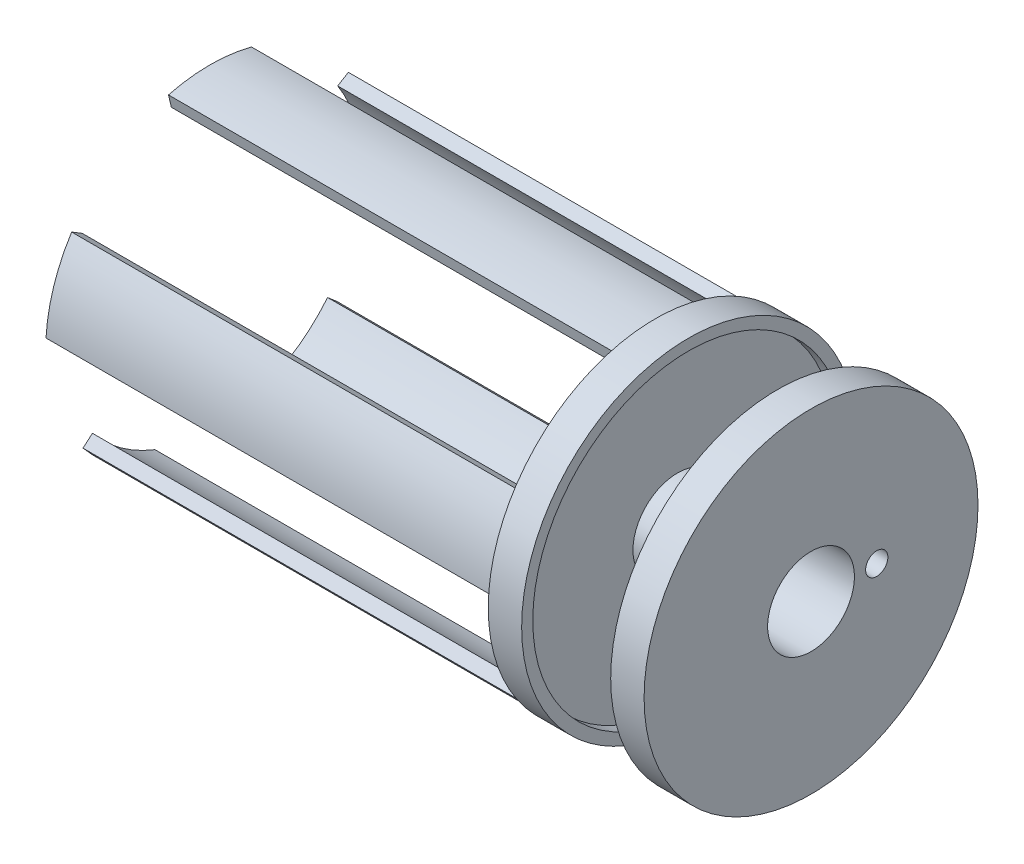
ISO-10303-21;
HEADER;
FILE_DESCRIPTION(('STEP AP214'),'2;1');
FILE_NAME('part.step','',(''),(''),'','','');
FILE_SCHEMA(('AUTOMOTIVE_DESIGN { 1 0 10303 214 1 1 1 1 }'));
ENDSEC;
DATA;
#1=APPLICATION_CONTEXT('core data for automotive mechanical design processes');
#2=APPLICATION_PROTOCOL_DEFINITION('international standard','automotive_design',2000,#1);
#3=PRODUCT_CONTEXT('',#1,'mechanical');
#4=PRODUCT('Part','Part','',(#3));
#5=PRODUCT_RELATED_PRODUCT_CATEGORY('part','',(#4));
#6=PRODUCT_DEFINITION_FORMATION('','',#4);
#7=PRODUCT_DEFINITION_CONTEXT('part definition',#1,'design');
#8=PRODUCT_DEFINITION('design','',#6,#7);
#9=PRODUCT_DEFINITION_SHAPE('','',#8);
#10=(LENGTH_UNIT() NAMED_UNIT(*) SI_UNIT(.MILLI.,.METRE.));
#11=(NAMED_UNIT(*) PLANE_ANGLE_UNIT() SI_UNIT($,.RADIAN.));
#12=(NAMED_UNIT(*) SI_UNIT($,.STERADIAN.) SOLID_ANGLE_UNIT());
#13=UNCERTAINTY_MEASURE_WITH_UNIT(LENGTH_MEASURE(1.E-05),#10,'distance_accuracy_value','');
#14=(GEOMETRIC_REPRESENTATION_CONTEXT(3) GLOBAL_UNCERTAINTY_ASSIGNED_CONTEXT((#13)) GLOBAL_UNIT_ASSIGNED_CONTEXT((#10,
#11,#12)) REPRESENTATION_CONTEXT('',''));
#15=CARTESIAN_POINT('',(0.,0.,0.));
#16=DIRECTION('',(0.,0.,1.));
#17=DIRECTION('',(1.,0.,0.));
#18=AXIS2_PLACEMENT_3D('',#15,#16,#17);
#19=CARTESIAN_POINT('',(-52.1153846153846,0.,0.));
#20=DIRECTION('',(1.,0.,0.));
#21=DIRECTION('',(0.,0.,-1.));
#22=AXIS2_PLACEMENT_3D('',#19,#20,#21);
#23=PLANE('',#22);
#24=CARTESIAN_POINT('',(-52.1153846153846,0.,0.));
#25=DIRECTION('',(1.,0.,0.));
#26=DIRECTION('',(0.,0.,-1.));
#27=AXIS2_PLACEMENT_3D('',#24,#25,#26);
#28=CIRCLE('',#27,19.5);
#29=CARTESIAN_POINT('',(-52.1153846153846,0.,-19.5));
#30=VERTEX_POINT('',#29);
#31=EDGE_CURVE('E199',#30,#30,#28,.T.);
#32=ORIENTED_EDGE('',*,*,#31,.T.);
#33=EDGE_LOOP('',(#32));
#34=FACE_BOUND('',#33,.T.);
#35=CARTESIAN_POINT('',(-52.1153846153846,0.,0.));
#36=DIRECTION('',(-1.,0.,0.));
#37=DIRECTION('',(0.,0.,1.));
#38=AXIS2_PLACEMENT_3D('',#35,#36,#37);
#39=CIRCLE('',#38,75.);
#40=CARTESIAN_POINT('',(-52.1153846153846,0.,75.));
#41=VERTEX_POINT('',#40);
#42=EDGE_CURVE('E11',#41,#41,#39,.T.);
#43=ORIENTED_EDGE('',*,*,#42,.T.);
#44=EDGE_LOOP('',(#43));
#45=FACE_BOUND('',#44,.T.);
#46=CARTESIAN_POINT('',(-52.1153846153846,0.,0.));
#47=DIRECTION('',(-1.,0.,0.));
#48=DIRECTION('',(0.,0.,1.));
#49=AXIS2_PLACEMENT_3D('',#46,#47,#48);
#50=CIRCLE('',#49,73.8);
#51=CARTESIAN_POINT('',(-52.1153846153846,71.4045453496025,18.6502252913083));
#52=VERTEX_POINT('',#51);
#53=CARTESIAN_POINT('',(-52.1153846153846,71.4045453496025,-18.6502252913083));
#54=VERTEX_POINT('',#53);
#55=EDGE_CURVE('E304',#52,#54,#50,.T.);
#56=ORIENTED_EDGE('',*,*,#55,.F.);
#57=DIRECTION('',(0.,-0.973417168333576,-0.229039333725548));
#58=VECTOR('',#57,1.);
#59=CARTESIAN_POINT('',(-52.1153846153846,71.4045453496025,18.6502252913083));
#60=LINE('',#59,#58);
#61=CARTESIAN_POINT('',(-52.1153846153846,65.9516538255794,17.3671919915382));
#62=VERTEX_POINT('',#61);
#63=EDGE_CURVE('E292',#52,#62,#60,.T.);
#64=ORIENTED_EDGE('',*,*,#63,.T.);
#65=CARTESIAN_POINT('',(-52.1153846153846,0.,0.));
#66=DIRECTION('',(-1.,0.,0.));
#67=DIRECTION('',(0.,0.,1.));
#68=AXIS2_PLACEMENT_3D('',#65,#66,#67);
#69=CIRCLE('',#68,68.2);
#70=CARTESIAN_POINT('',(-52.1153846153846,65.9516538255794,-17.3671919915382));
#71=VERTEX_POINT('',#70);
#72=EDGE_CURVE('E314',#62,#71,#69,.T.);
#73=ORIENTED_EDGE('',*,*,#72,.T.);
#74=DIRECTION('',(0.,-0.973417168333576,0.229039333725548));
#75=VECTOR('',#74,1.);
#76=CARTESIAN_POINT('',(-52.1153846153846,71.4045453496025,-18.6502252913083));
#77=LINE('',#76,#75);
#78=EDGE_CURVE('E317',#54,#71,#77,.T.);
#79=ORIENTED_EDGE('',*,*,#78,.F.);
#80=EDGE_LOOP('',(#56,#64,#73,#79));
#81=FACE_BOUND('',#80,.T.);
#82=CARTESIAN_POINT('',(-52.1153846153846,0.,0.));
#83=DIRECTION('',(-1.,0.,0.));
#84=DIRECTION('',(0.,0.951056516295155,0.309016994374945));
#85=AXIS2_PLACEMENT_3D('',#82,#83,#84);
#86=CIRCLE('',#85,73.8);
#87=CARTESIAN_POINT('',(-52.1153846153846,39.8026362823151,-62.1465215838967));
#88=VERTEX_POINT('',#87);
#89=CARTESIAN_POINT('',(-52.1153846153846,4.32779969497213,-73.672994711768));
#90=VERTEX_POINT('',#89);
#91=EDGE_CURVE('E274',#88,#90,#86,.T.);
#92=ORIENTED_EDGE('',*,*,#91,.F.);
#93=DIRECTION('',(0.,-0.518631798458994,0.854997694515716));
#94=VECTOR('',#93,1.);
#95=CARTESIAN_POINT('',(-52.1153846153846,39.8026362823151,-62.1465215838967));
#96=LINE('',#95,#94);
#97=CARTESIAN_POINT('',(-52.1153846153846,36.8973629525388,-57.3569926613018));
#98=VERTEX_POINT('',#97);
#99=EDGE_CURVE('E262',#88,#98,#96,.T.);
#100=ORIENTED_EDGE('',*,*,#99,.T.);
#101=CARTESIAN_POINT('',(-52.1153846153846,0.,0.));
#102=DIRECTION('',(-1.,0.,0.));
#103=DIRECTION('',(0.,0.951056516295155,0.309016994374945));
#104=AXIS2_PLACEMENT_3D('',#101,#102,#103);
#105=CIRCLE('',#104,68.2);
#106=CARTESIAN_POINT('',(-52.1153846153846,3.86300072593597,-68.0905076012172));
#107=VERTEX_POINT('',#106);
#108=EDGE_CURVE('E284',#98,#107,#105,.T.);
#109=ORIENTED_EDGE('',*,*,#108,.T.);
#110=DIRECTION('',(0.,-0.0829730968038282,0.996551787518733));
#111=VECTOR('',#110,1.);
#112=CARTESIAN_POINT('',(-52.1153846153846,4.32779969497213,-73.672994711768));
#113=LINE('',#112,#111);
#114=EDGE_CURVE('E287',#90,#107,#113,.T.);
#115=ORIENTED_EDGE('',*,*,#114,.F.);
#116=EDGE_LOOP('',(#92,#100,#109,#115));
#117=FACE_BOUND('',#116,.T.);
#118=CARTESIAN_POINT('',(-52.1153846153846,0.,0.));
#119=DIRECTION('',(-1.,0.,0.));
#120=DIRECTION('',(0.,0.587785252292469,-0.809016994374951));
#121=AXIS2_PLACEMENT_3D('',#118,#119,#120);
#122=CIRCLE('',#121,73.8);
#123=CARTESIAN_POINT('',(-52.1153846153846,-46.8051632852823,-57.0588879127351));
#124=VERTEX_POINT('',#123);
#125=CARTESIAN_POINT('',(-52.1153846153846,-68.7298180416083,-26.8821894935552));
#126=VERTEX_POINT('',#125);
#127=EDGE_CURVE('E244',#124,#126,#122,.T.);
#128=ORIENTED_EDGE('',*,*,#127,.F.);
#129=DIRECTION('',(0.,0.652885089239435,0.757456969239055));
#130=VECTOR('',#129,1.);
#131=CARTESIAN_POINT('',(-52.1153846153846,-46.8051632852823,-57.0588879127351));
#132=LINE('',#131,#130);
#133=CARTESIAN_POINT('',(-52.1153846153846,-43.1478294256694,-52.8157629487006));
#134=VERTEX_POINT('',#133);
#135=EDGE_CURVE('E234',#124,#134,#132,.T.);
#136=ORIENTED_EDGE('',*,*,#135,.T.);
#137=CARTESIAN_POINT('',(-52.1153846153846,0.,0.));
#138=DIRECTION('',(-1.,0.,0.));
#139=DIRECTION('',(0.,0.587785252292469,-0.809016994374951));
#140=AXIS2_PLACEMENT_3D('',#137,#138,#139);
#141=CIRCLE('',#140,68.2);
#142=CARTESIAN_POINT('',(-52.1153846153846,-63.5641880783854,-24.7150560172468));
#143=VERTEX_POINT('',#142);
#144=EDGE_CURVE('E254',#134,#143,#141,.T.);
#145=ORIENTED_EDGE('',*,*,#144,.T.);
#146=DIRECTION('',(0.,0.922136974356975,0.386863542510487));
#147=VECTOR('',#146,1.);
#148=CARTESIAN_POINT('',(-52.1153846153846,-68.7298180416083,-26.8821894935552));
#149=LINE('',#148,#147);
#150=EDGE_CURVE('E257',#126,#143,#149,.T.);
#151=ORIENTED_EDGE('',*,*,#150,.F.);
#152=EDGE_LOOP('',(#128,#136,#145,#151));
#153=FACE_BOUND('',#152,.T.);
#154=CARTESIAN_POINT('',(-52.1153846153846,0.,0.));
#155=DIRECTION('',(-1.,0.,0.));
#156=DIRECTION('',(0.,-0.58778525229248,-0.809016994374942));
#157=AXIS2_PLACEMENT_3D('',#154,#155,#156);
#158=CIRCLE('',#157,73.8);
#159=CARTESIAN_POINT('',(-52.1153846153846,-68.729818041608,26.8821894935562));
#160=VERTEX_POINT('',#159);
#161=CARTESIAN_POINT('',(-52.1153846153846,-46.8051632852814,57.0588879127358));
#162=VERTEX_POINT('',#161);
#163=EDGE_CURVE('E217',#160,#162,#158,.T.);
#164=ORIENTED_EDGE('',*,*,#163,.F.);
#165=DIRECTION('',(0.,0.922136974356969,-0.3868635425105));
#166=VECTOR('',#165,1.);
#167=CARTESIAN_POINT('',(-52.1153846153846,-68.729818041608,26.8821894935562));
#168=LINE('',#167,#166);
#169=CARTESIAN_POINT('',(-52.1153846153846,-63.5641880783851,24.7150560172477));
#170=VERTEX_POINT('',#169);
#171=EDGE_CURVE('E209',#160,#170,#168,.T.);
#172=ORIENTED_EDGE('',*,*,#171,.T.);
#173=CARTESIAN_POINT('',(-52.1153846153846,0.,0.));
#174=DIRECTION('',(-1.,0.,0.));
#175=DIRECTION('',(0.,-0.58778525229248,-0.809016994374942));
#176=AXIS2_PLACEMENT_3D('',#173,#174,#175);
#177=CIRCLE('',#176,68.2);
#178=CARTESIAN_POINT('',(-52.1153846153846,-43.1478294256687,52.8157629487012));
#179=VERTEX_POINT('',#178);
#180=EDGE_CURVE('E227',#170,#179,#177,.T.);
#181=ORIENTED_EDGE('',*,*,#180,.T.);
#182=DIRECTION('',(0.,0.652885089239424,-0.757456969239065));
#183=VECTOR('',#182,1.);
#184=CARTESIAN_POINT('',(-52.1153846153846,-46.8051632852814,57.0588879127358));
#185=LINE('',#184,#183);
#186=EDGE_CURVE('E54',#162,#179,#185,.T.);
#187=ORIENTED_EDGE('',*,*,#186,.F.);
#188=EDGE_LOOP('',(#164,#172,#181,#187));
#189=FACE_BOUND('',#188,.T.);
#190=CARTESIAN_POINT('',(-52.1153846153846,0.,0.));
#191=DIRECTION('',(-1.,0.,0.));
#192=DIRECTION('',(0.,-0.95105651629515,0.309016994374958));
#193=AXIS2_PLACEMENT_3D('',#190,#191,#192);
#194=CIRCLE('',#193,73.8);
#195=CARTESIAN_POINT('',(-52.1153846153846,4.32779969497318,73.672994711768));
#196=VERTEX_POINT('',#195);
#197=CARTESIAN_POINT('',(-52.1153846153846,39.802636282316,62.1465215838961));
#198=VERTEX_POINT('',#197);
#199=EDGE_CURVE('E195',#196,#198,#194,.T.);
#200=ORIENTED_EDGE('',*,*,#199,.F.);
#201=DIRECTION('',(0.,-0.0829730968038423,-0.996551787518732));
#202=VECTOR('',#201,1.);
#203=CARTESIAN_POINT('',(-52.1153846153846,4.32779969497318,73.672994711768));
#204=LINE('',#203,#202);
#205=CARTESIAN_POINT('',(-52.1153846153846,3.86300072593693,68.0905076012172));
#206=VERTEX_POINT('',#205);
#207=EDGE_CURVE('E204',#196,#206,#204,.T.);
#208=ORIENTED_EDGE('',*,*,#207,.T.);
#209=CARTESIAN_POINT('',(-52.1153846153846,0.,0.));
#210=DIRECTION('',(-1.,0.,0.));
#211=DIRECTION('',(0.,-0.95105651629515,0.309016994374958));
#212=AXIS2_PLACEMENT_3D('',#209,#210,#211);
#213=CIRCLE('',#212,68.2);
#214=CARTESIAN_POINT('',(-52.1153846153846,36.8973629525396,57.3569926613012));
#215=VERTEX_POINT('',#214);
#216=EDGE_CURVE('E177',#206,#215,#213,.T.);
#217=ORIENTED_EDGE('',*,*,#216,.T.);
#218=DIRECTION('',(0.,-0.518631798459006,-0.854997694515708));
#219=VECTOR('',#218,1.);
#220=CARTESIAN_POINT('',(-52.1153846153846,39.802636282316,62.1465215838961));
#221=LINE('',#220,#219);
#222=EDGE_CURVE('E46',#198,#215,#221,.T.);
#223=ORIENTED_EDGE('',*,*,#222,.F.);
#224=EDGE_LOOP('',(#200,#208,#217,#223));
#225=FACE_BOUND('',#224,.T.);
#226=ADVANCED_FACE('F32',(#34,#45,#81,#117,#153,#189,#225),#23,.F.);
#227=CARTESIAN_POINT('',(-114.196582099836,0.,0.));
#228=DIRECTION('',(-1.,0.,0.));
#229=DIRECTION('',(0.,0.,1.));
#230=AXIS2_PLACEMENT_3D('',#227,#228,#229);
#231=CYLINDRICAL_SURFACE('',#230,75.);
#232=ORIENTED_EDGE('',*,*,#42,.F.);
#233=EDGE_LOOP('',(#232));
#234=FACE_BOUND('',#233,.T.);
#235=CARTESIAN_POINT('',(-37.1153846153846,0.,0.));
#236=DIRECTION('',(-1.,0.,0.));
#237=DIRECTION('',(0.,0.,1.));
#238=AXIS2_PLACEMENT_3D('',#235,#236,#237);
#239=CIRCLE('',#238,75.);
#240=CARTESIAN_POINT('',(-37.1153846153846,0.,75.));
#241=VERTEX_POINT('',#240);
#242=EDGE_CURVE('E39',#241,#241,#239,.T.);
#243=ORIENTED_EDGE('',*,*,#242,.T.);
#244=EDGE_LOOP('',(#243));
#245=FACE_BOUND('',#244,.T.);
#246=ADVANCED_FACE('F361',(#234,#245),#231,.T.);
#247=CARTESIAN_POINT('',(-37.1153846153846,75.,0.));
#248=DIRECTION('',(-1.,0.,0.));
#249=DIRECTION('',(0.,0.,1.));
#250=AXIS2_PLACEMENT_3D('',#247,#248,#249);
#251=PLANE('',#250);
#252=ORIENTED_EDGE('',*,*,#242,.F.);
#253=EDGE_LOOP('',(#252));
#254=FACE_BOUND('',#253,.T.);
#255=CARTESIAN_POINT('',(-37.1153846153846,0.,0.));
#256=DIRECTION('',(-1.,0.,0.));
#257=DIRECTION('',(0.,0.,1.));
#258=AXIS2_PLACEMENT_3D('',#255,#256,#257);
#259=CIRCLE('',#258,70.);
#260=CARTESIAN_POINT('',(-37.1153846153846,0.,70.));
#261=VERTEX_POINT('',#260);
#262=EDGE_CURVE('E356',#261,#261,#259,.T.);
#263=ORIENTED_EDGE('',*,*,#262,.T.);
#264=EDGE_LOOP('',(#263));
#265=FACE_BOUND('',#264,.T.);
#266=ADVANCED_FACE('F363',(#254,#265),#251,.F.);
#267=CARTESIAN_POINT('',(-114.196582099836,0.,0.));
#268=DIRECTION('',(-1.,0.,0.));
#269=DIRECTION('',(0.,0.,1.));
#270=AXIS2_PLACEMENT_3D('',#267,#268,#269);
#271=CYLINDRICAL_SURFACE('',#270,70.);
#272=ORIENTED_EDGE('',*,*,#262,.F.);
#273=EDGE_LOOP('',(#272));
#274=FACE_BOUND('',#273,.T.);
#275=CARTESIAN_POINT('',(-42.1153846153846,0.,0.));
#276=DIRECTION('',(-1.,0.,0.));
#277=DIRECTION('',(0.,0.,1.));
#278=AXIS2_PLACEMENT_3D('',#275,#276,#277);
#279=CIRCLE('',#278,70.);
#280=CARTESIAN_POINT('',(-42.1153846153846,0.,70.));
#281=VERTEX_POINT('',#280);
#282=EDGE_CURVE('E353',#281,#281,#279,.T.);
#283=ORIENTED_EDGE('',*,*,#282,.T.);
#284=EDGE_LOOP('',(#283));
#285=FACE_BOUND('',#284,.T.);
#286=ADVANCED_FACE('F366',(#274,#285),#271,.F.);
#287=CARTESIAN_POINT('',(-42.1153846153846,70.,0.));
#288=DIRECTION('',(-1.,0.,0.));
#289=DIRECTION('',(0.,0.,1.));
#290=AXIS2_PLACEMENT_3D('',#287,#288,#289);
#291=PLANE('',#290);
#292=ORIENTED_EDGE('',*,*,#282,.F.);
#293=EDGE_LOOP('',(#292));
#294=FACE_BOUND('',#293,.T.);
#295=CARTESIAN_POINT('',(-42.1153846153846,0.,0.));
#296=DIRECTION('',(-1.,0.,0.));
#297=DIRECTION('',(0.,0.,1.));
#298=AXIS2_PLACEMENT_3D('',#295,#296,#297);
#299=CIRCLE('',#298,20.);
#300=CARTESIAN_POINT('',(-42.1153846153846,0.,20.));
#301=VERTEX_POINT('',#300);
#302=EDGE_CURVE('E350',#301,#301,#299,.T.);
#303=ORIENTED_EDGE('',*,*,#302,.T.);
#304=EDGE_LOOP('',(#303));
#305=FACE_BOUND('',#304,.T.);
#306=ADVANCED_FACE('F372',(#294,#305),#291,.F.);
#307=CARTESIAN_POINT('',(-114.196582099836,0.,0.));
#308=DIRECTION('',(-1.,0.,0.));
#309=DIRECTION('',(0.,0.,1.));
#310=AXIS2_PLACEMENT_3D('',#307,#308,#309);
#311=CYLINDRICAL_SURFACE('',#310,20.);
#312=ORIENTED_EDGE('',*,*,#302,.F.);
#313=EDGE_LOOP('',(#312));
#314=FACE_BOUND('',#313,.T.);
#315=CARTESIAN_POINT('',(7.88461538461538,0.,0.));
#316=DIRECTION('',(-1.,0.,0.));
#317=DIRECTION('',(0.,0.,1.));
#318=AXIS2_PLACEMENT_3D('',#315,#316,#317);
#319=CIRCLE('',#318,20.);
#320=CARTESIAN_POINT('',(7.88461538461538,0.,20.));
#321=VERTEX_POINT('',#320);
#322=EDGE_CURVE('E347',#321,#321,#319,.T.);
#323=ORIENTED_EDGE('',*,*,#322,.T.);
#324=EDGE_LOOP('',(#323));
#325=FACE_BOUND('',#324,.T.);
#326=ADVANCED_FACE('F378',(#314,#325),#311,.T.);
#327=CARTESIAN_POINT('',(7.88461538461539,20.,0.));
#328=DIRECTION('',(1.,0.,0.));
#329=DIRECTION('',(0.,0.,-1.));
#330=AXIS2_PLACEMENT_3D('',#327,#328,#329);
#331=PLANE('',#330);
#332=CARTESIAN_POINT('',(7.88461538461539,0.,-29.5197008608615));
#333=DIRECTION('',(1.,0.,0.));
#334=DIRECTION('',(0.,0.,-1.));
#335=AXIS2_PLACEMENT_3D('',#332,#333,#334);
#336=CIRCLE('',#335,5.);
#337=CARTESIAN_POINT('',(7.88461538461539,0.,-34.5197008608615));
#338=VERTEX_POINT('',#337);
#339=EDGE_CURVE('E332',#338,#338,#336,.T.);
#340=ORIENTED_EDGE('',*,*,#339,.T.);
#341=EDGE_LOOP('',(#340));
#342=FACE_BOUND('',#341,.T.);
#343=ORIENTED_EDGE('',*,*,#322,.F.);
#344=EDGE_LOOP('',(#343));
#345=FACE_BOUND('',#344,.T.);
#346=CARTESIAN_POINT('',(7.88461538461538,0.,0.));
#347=DIRECTION('',(-1.,0.,0.));
#348=DIRECTION('',(0.,0.,1.));
#349=AXIS2_PLACEMENT_3D('',#346,#347,#348);
#350=CIRCLE('',#349,70.);
#351=CARTESIAN_POINT('',(7.88461538461538,0.,70.));
#352=VERTEX_POINT('',#351);
#353=EDGE_CURVE('E344',#352,#352,#350,.T.);
#354=ORIENTED_EDGE('',*,*,#353,.T.);
#355=EDGE_LOOP('',(#354));
#356=FACE_BOUND('',#355,.T.);
#357=ADVANCED_FACE('F384',(#342,#345,#356),#331,.F.);
#358=CARTESIAN_POINT('',(-114.196582099836,0.,0.));
#359=DIRECTION('',(-1.,0.,0.));
#360=DIRECTION('',(0.,0.,1.));
#361=AXIS2_PLACEMENT_3D('',#358,#359,#360);
#362=CYLINDRICAL_SURFACE('',#361,70.);
#363=ORIENTED_EDGE('',*,*,#353,.F.);
#364=EDGE_LOOP('',(#363));
#365=FACE_BOUND('',#364,.T.);
#366=CARTESIAN_POINT('',(2.88461538461539,0.,0.));
#367=DIRECTION('',(-1.,0.,0.));
#368=DIRECTION('',(0.,0.,1.));
#369=AXIS2_PLACEMENT_3D('',#366,#367,#368);
#370=CIRCLE('',#369,70.);
#371=CARTESIAN_POINT('',(2.88461538461539,0.,70.));
#372=VERTEX_POINT('',#371);
#373=EDGE_CURVE('E341',#372,#372,#370,.T.);
#374=ORIENTED_EDGE('',*,*,#373,.T.);
#375=EDGE_LOOP('',(#374));
#376=FACE_BOUND('',#375,.T.);
#377=ADVANCED_FACE('F390',(#365,#376),#362,.F.);
#378=CARTESIAN_POINT('',(2.88461538461539,70.,0.));
#379=DIRECTION('',(1.,0.,0.));
#380=DIRECTION('',(0.,0.,-1.));
#381=AXIS2_PLACEMENT_3D('',#378,#379,#380);
#382=PLANE('',#381);
#383=ORIENTED_EDGE('',*,*,#373,.F.);
#384=EDGE_LOOP('',(#383));
#385=FACE_BOUND('',#384,.T.);
#386=CARTESIAN_POINT('',(2.88461538461539,0.,0.));
#387=DIRECTION('',(-1.,0.,0.));
#388=DIRECTION('',(0.,0.,1.));
#389=AXIS2_PLACEMENT_3D('',#386,#387,#388);
#390=CIRCLE('',#389,75.);
#391=CARTESIAN_POINT('',(2.88461538461539,0.,75.));
#392=VERTEX_POINT('',#391);
#393=EDGE_CURVE('E338',#392,#392,#390,.T.);
#394=ORIENTED_EDGE('',*,*,#393,.T.);
#395=EDGE_LOOP('',(#394));
#396=FACE_BOUND('',#395,.T.);
#397=ADVANCED_FACE('F397',(#385,#396),#382,.F.);
#398=CARTESIAN_POINT('',(-114.196582099836,0.,0.));
#399=DIRECTION('',(-1.,0.,0.));
#400=DIRECTION('',(0.,0.,1.));
#401=AXIS2_PLACEMENT_3D('',#398,#399,#400);
#402=CYLINDRICAL_SURFACE('',#401,75.);
#403=ORIENTED_EDGE('',*,*,#393,.F.);
#404=EDGE_LOOP('',(#403));
#405=FACE_BOUND('',#404,.T.);
#406=CARTESIAN_POINT('',(17.8846153846154,0.,0.));
#407=DIRECTION('',(-1.,0.,0.));
#408=DIRECTION('',(0.,0.,1.));
#409=AXIS2_PLACEMENT_3D('',#406,#407,#408);
#410=CIRCLE('',#409,75.);
#411=CARTESIAN_POINT('',(17.8846153846154,0.,75.));
#412=VERTEX_POINT('',#411);
#413=EDGE_CURVE('E335',#412,#412,#410,.T.);
#414=ORIENTED_EDGE('',*,*,#413,.T.);
#415=EDGE_LOOP('',(#414));
#416=FACE_BOUND('',#415,.T.);
#417=ADVANCED_FACE('F403',(#405,#416),#402,.T.);
#418=CARTESIAN_POINT('',(17.8846153846154,75.,0.));
#419=DIRECTION('',(-1.,0.,0.));
#420=DIRECTION('',(0.,0.,1.));
#421=AXIS2_PLACEMENT_3D('',#418,#419,#420);
#422=PLANE('',#421);
#423=CARTESIAN_POINT('',(17.8846153846154,0.,0.));
#424=DIRECTION('',(1.,0.,0.));
#425=DIRECTION('',(0.,0.,-1.));
#426=AXIS2_PLACEMENT_3D('',#423,#424,#425);
#427=CIRCLE('',#426,19.5);
#428=CARTESIAN_POINT('',(17.8846153846154,0.,-19.5));
#429=VERTEX_POINT('',#428);
#430=EDGE_CURVE('E680',#429,#429,#427,.T.);
#431=ORIENTED_EDGE('',*,*,#430,.F.);
#432=EDGE_LOOP('',(#431));
#433=FACE_BOUND('',#432,.T.);
#434=CARTESIAN_POINT('',(17.8846153846154,0.,-29.5197008608615));
#435=DIRECTION('',(1.,0.,0.));
#436=DIRECTION('',(0.,0.,-1.));
#437=AXIS2_PLACEMENT_3D('',#434,#435,#436);
#438=CIRCLE('',#437,5.);
#439=CARTESIAN_POINT('',(17.8846153846154,0.,-34.5197008608615));
#440=VERTEX_POINT('',#439);
#441=EDGE_CURVE('E322',#440,#440,#438,.T.);
#442=ORIENTED_EDGE('',*,*,#441,.F.);
#443=EDGE_LOOP('',(#442));
#444=FACE_BOUND('',#443,.T.);
#445=ORIENTED_EDGE('',*,*,#413,.F.);
#446=EDGE_LOOP('',(#445));
#447=FACE_BOUND('',#446,.T.);
#448=ADVANCED_FACE('F409',(#433,#444,#447),#422,.F.);
#449=CARTESIAN_POINT('',(1.88461538461537,0.,-29.5197008608615));
#450=DIRECTION('',(1.,0.,0.));
#451=DIRECTION('',(0.,0.,-1.));
#452=AXIS2_PLACEMENT_3D('',#449,#450,#451);
#453=CYLINDRICAL_SURFACE('',#452,5.);
#454=ORIENTED_EDGE('',*,*,#441,.T.);
#455=EDGE_LOOP('',(#454));
#456=FACE_BOUND('',#455,.T.);
#457=ORIENTED_EDGE('',*,*,#339,.F.);
#458=EDGE_LOOP('',(#457));
#459=FACE_BOUND('',#458,.T.);
#460=ADVANCED_FACE('F414',(#456,#459),#453,.F.);
#461=CARTESIAN_POINT('',(-252.115384615385,71.4045453496025,18.6502252913083));
#462=DIRECTION('',(0.,-0.229039333725548,0.973417168333576));
#463=DIRECTION('',(0.,-0.973417168333576,-0.229039333725548));
#464=AXIS2_PLACEMENT_3D('',#461,#462,#463);
#465=PLANE('',#464);
#466=ORIENTED_EDGE('',*,*,#63,.F.);
#467=DIRECTION('',(1.,0.,0.));
#468=VECTOR('',#467,1.);
#469=CARTESIAN_POINT('',(-252.115384615385,71.4045453496025,18.6502252913083));
#470=LINE('',#469,#468);
#471=CARTESIAN_POINT('',(-252.115384615385,71.4045453496025,18.6502252913083));
#472=VERTEX_POINT('',#471);
#473=EDGE_CURVE('E320',#472,#52,#470,.T.);
#474=ORIENTED_EDGE('',*,*,#473,.F.);
#475=DIRECTION('',(0.,-0.973417168333576,-0.229039333725548));
#476=VECTOR('',#475,1.);
#477=CARTESIAN_POINT('',(-252.115384615385,71.4045453496025,18.6502252913083));
#478=LINE('',#477,#476);
#479=CARTESIAN_POINT('',(-252.115384615385,65.9516538255794,17.3671919915382));
#480=VERTEX_POINT('',#479);
#481=EDGE_CURVE('E300',#472,#480,#478,.T.);
#482=ORIENTED_EDGE('',*,*,#481,.T.);
#483=DIRECTION('',(1.,0.,0.));
#484=VECTOR('',#483,1.);
#485=CARTESIAN_POINT('',(-252.115384615385,65.9516538255794,17.3671919915382));
#486=LINE('',#485,#484);
#487=EDGE_CURVE('E311',#480,#62,#486,.T.);
#488=ORIENTED_EDGE('',*,*,#487,.T.);
#489=EDGE_LOOP('',(#466,#474,#482,#488));
#490=FACE_BOUND('',#489,.T.);
#491=ADVANCED_FACE('F420',(#490),#465,.T.);
#492=CARTESIAN_POINT('',(-252.115384615385,0.,0.));
#493=DIRECTION('',(1.,0.,0.));
#494=DIRECTION('',(0.,0.,-1.));
#495=AXIS2_PLACEMENT_3D('',#492,#493,#494);
#496=CYLINDRICAL_SURFACE('',#495,73.8);
#497=ORIENTED_EDGE('',*,*,#55,.T.);
#498=DIRECTION('',(1.,0.,0.));
#499=VECTOR('',#498,1.);
#500=CARTESIAN_POINT('',(-252.115384615385,71.4045453496025,-18.6502252913083));
#501=LINE('',#500,#499);
#502=CARTESIAN_POINT('',(-252.115384615385,71.4045453496025,-18.6502252913083));
#503=VERTEX_POINT('',#502);
#504=EDGE_CURVE('E323',#503,#54,#501,.T.);
#505=ORIENTED_EDGE('',*,*,#504,.F.);
#506=CARTESIAN_POINT('',(-252.115384615385,0.,0.));
#507=DIRECTION('',(-1.,0.,0.));
#508=DIRECTION('',(0.,0.,1.));
#509=AXIS2_PLACEMENT_3D('',#506,#507,#508);
#510=CIRCLE('',#509,73.8);
#511=EDGE_CURVE('E309',#472,#503,#510,.T.);
#512=ORIENTED_EDGE('',*,*,#511,.F.);
#513=ORIENTED_EDGE('',*,*,#473,.T.);
#514=EDGE_LOOP('',(#497,#505,#512,#513));
#515=FACE_BOUND('',#514,.T.);
#516=ADVANCED_FACE('F528',(#515),#496,.T.);
#517=CARTESIAN_POINT('',(-252.115384615385,71.4045453496025,-18.6502252913083));
#518=DIRECTION('',(0.,0.229039333725548,0.973417168333576));
#519=DIRECTION('',(0.,-0.973417168333576,0.229039333725548));
#520=AXIS2_PLACEMENT_3D('',#517,#518,#519);
#521=PLANE('',#520);
#522=ORIENTED_EDGE('',*,*,#78,.T.);
#523=DIRECTION('',(1.,0.,0.));
#524=VECTOR('',#523,1.);
#525=CARTESIAN_POINT('',(-252.115384615385,65.9516538255794,-17.3671919915382));
#526=LINE('',#525,#524);
#527=CARTESIAN_POINT('',(-252.115384615385,65.9516538255794,-17.3671919915382));
#528=VERTEX_POINT('',#527);
#529=EDGE_CURVE('E326',#528,#71,#526,.T.);
#530=ORIENTED_EDGE('',*,*,#529,.F.);
#531=DIRECTION('',(0.,-0.973417168333576,0.229039333725548));
#532=VECTOR('',#531,1.);
#533=CARTESIAN_POINT('',(-252.115384615385,71.4045453496025,-18.6502252913083));
#534=LINE('',#533,#532);
#535=EDGE_CURVE('E307',#503,#528,#534,.T.);
#536=ORIENTED_EDGE('',*,*,#535,.F.);
#537=ORIENTED_EDGE('',*,*,#504,.T.);
#538=EDGE_LOOP('',(#522,#530,#536,#537));
#539=FACE_BOUND('',#538,.T.);
#540=ADVANCED_FACE('F531',(#539),#521,.F.);
#541=CARTESIAN_POINT('',(-252.115384615385,0.,0.));
#542=DIRECTION('',(1.,0.,0.));
#543=DIRECTION('',(0.,0.,-1.));
#544=AXIS2_PLACEMENT_3D('',#541,#542,#543);
#545=CYLINDRICAL_SURFACE('',#544,68.2);
#546=ORIENTED_EDGE('',*,*,#72,.F.);
#547=ORIENTED_EDGE('',*,*,#487,.F.);
#548=CARTESIAN_POINT('',(-252.115384615385,0.,0.));
#549=DIRECTION('',(-1.,0.,0.));
#550=DIRECTION('',(0.,0.,1.));
#551=AXIS2_PLACEMENT_3D('',#548,#549,#550);
#552=CIRCLE('',#551,68.2);
#553=EDGE_CURVE('E303',#480,#528,#552,.T.);
#554=ORIENTED_EDGE('',*,*,#553,.T.);
#555=ORIENTED_EDGE('',*,*,#529,.T.);
#556=EDGE_LOOP('',(#546,#547,#554,#555));
#557=FACE_BOUND('',#556,.T.);
#558=ADVANCED_FACE('F526',(#557),#545,.F.);
#559=CARTESIAN_POINT('',(-252.115384615385,0.,0.));
#560=DIRECTION('',(-1.,0.,0.));
#561=DIRECTION('',(0.,0.,1.));
#562=AXIS2_PLACEMENT_3D('',#559,#560,#561);
#563=PLANE('',#562);
#564=ORIENTED_EDGE('',*,*,#481,.F.);
#565=ORIENTED_EDGE('',*,*,#511,.T.);
#566=ORIENTED_EDGE('',*,*,#535,.T.);
#567=ORIENTED_EDGE('',*,*,#553,.F.);
#568=EDGE_LOOP('',(#564,#565,#566,#567));
#569=FACE_BOUND('',#568,.T.);
#570=ADVANCED_FACE('F522',(#569),#563,.T.);
#571=CARTESIAN_POINT('',(-252.115384615385,39.8026362823151,-62.1465215838967));
#572=DIRECTION('',(0.,0.854997694515716,0.518631798458994));
#573=DIRECTION('',(0.,-0.518631798458994,0.854997694515716));
#574=AXIS2_PLACEMENT_3D('',#571,#572,#573);
#575=PLANE('',#574);
#576=ORIENTED_EDGE('',*,*,#99,.F.);
#577=DIRECTION('',(1.,0.,0.));
#578=VECTOR('',#577,1.);
#579=CARTESIAN_POINT('',(-252.115384615385,39.8026362823151,-62.1465215838967));
#580=LINE('',#579,#578);
#581=CARTESIAN_POINT('',(-252.115384615385,39.8026362823151,-62.1465215838967));
#582=VERTEX_POINT('',#581);
#583=EDGE_CURVE('E290',#582,#88,#580,.T.);
#584=ORIENTED_EDGE('',*,*,#583,.F.);
#585=DIRECTION('',(0.,-0.518631798458994,0.854997694515716));
#586=VECTOR('',#585,1.);
#587=CARTESIAN_POINT('',(-252.115384615385,39.8026362823151,-62.1465215838967));
#588=LINE('',#587,#586);
#589=CARTESIAN_POINT('',(-252.115384615385,36.8973629525388,-57.3569926613018));
#590=VERTEX_POINT('',#589);
#591=EDGE_CURVE('E270',#582,#590,#588,.T.);
#592=ORIENTED_EDGE('',*,*,#591,.T.);
#593=DIRECTION('',(1.,0.,0.));
#594=VECTOR('',#593,1.);
#595=CARTESIAN_POINT('',(-252.115384615385,36.8973629525388,-57.3569926613018));
#596=LINE('',#595,#594);
#597=EDGE_CURVE('E281',#590,#98,#596,.T.);
#598=ORIENTED_EDGE('',*,*,#597,.T.);
#599=EDGE_LOOP('',(#576,#584,#592,#598));
#600=FACE_BOUND('',#599,.T.);
#601=ADVANCED_FACE('F512',(#600),#575,.T.);
#602=CARTESIAN_POINT('',(-252.115384615385,0.,0.));
#603=DIRECTION('',(1.,0.,0.));
#604=DIRECTION('',(0.,0.,-1.));
#605=AXIS2_PLACEMENT_3D('',#602,#603,#604);
#606=CYLINDRICAL_SURFACE('',#605,73.8);
#607=ORIENTED_EDGE('',*,*,#91,.T.);
#608=DIRECTION('',(1.,0.,0.));
#609=VECTOR('',#608,1.);
#610=CARTESIAN_POINT('',(-252.115384615385,4.32779969497213,-73.672994711768));
#611=LINE('',#610,#609);
#612=CARTESIAN_POINT('',(-252.115384615385,4.32779969497213,-73.672994711768));
#613=VERTEX_POINT('',#612);
#614=EDGE_CURVE('E293',#613,#90,#611,.T.);
#615=ORIENTED_EDGE('',*,*,#614,.F.);
#616=CARTESIAN_POINT('',(-252.115384615385,0.,0.));
#617=DIRECTION('',(-1.,0.,0.));
#618=DIRECTION('',(0.,0.951056516295155,0.309016994374945));
#619=AXIS2_PLACEMENT_3D('',#616,#617,#618);
#620=CIRCLE('',#619,73.8);
#621=EDGE_CURVE('E279',#582,#613,#620,.T.);
#622=ORIENTED_EDGE('',*,*,#621,.F.);
#623=ORIENTED_EDGE('',*,*,#583,.T.);
#624=EDGE_LOOP('',(#607,#615,#622,#623));
#625=FACE_BOUND('',#624,.T.);
#626=ADVANCED_FACE('F508',(#625),#606,.T.);
#627=CARTESIAN_POINT('',(-252.115384615385,4.32779969497213,-73.672994711768));
#628=DIRECTION('',(0.,0.996551787518733,0.0829730968038282));
#629=DIRECTION('',(0.,-0.0829730968038282,0.996551787518733));
#630=AXIS2_PLACEMENT_3D('',#627,#628,#629);
#631=PLANE('',#630);
#632=ORIENTED_EDGE('',*,*,#114,.T.);
#633=DIRECTION('',(1.,0.,0.));
#634=VECTOR('',#633,1.);
#635=CARTESIAN_POINT('',(-252.115384615385,3.86300072593597,-68.0905076012173));
#636=LINE('',#635,#634);
#637=CARTESIAN_POINT('',(-252.115384615385,3.86300072593597,-68.0905076012173));
#638=VERTEX_POINT('',#637);
#639=EDGE_CURVE('E296',#638,#107,#636,.T.);
#640=ORIENTED_EDGE('',*,*,#639,.F.);
#641=DIRECTION('',(0.,-0.0829730968038282,0.996551787518733));
#642=VECTOR('',#641,1.);
#643=CARTESIAN_POINT('',(-252.115384615385,4.32779969497213,-73.672994711768));
#644=LINE('',#643,#642);
#645=EDGE_CURVE('E277',#613,#638,#644,.T.);
#646=ORIENTED_EDGE('',*,*,#645,.F.);
#647=ORIENTED_EDGE('',*,*,#614,.T.);
#648=EDGE_LOOP('',(#632,#640,#646,#647));
#649=FACE_BOUND('',#648,.T.);
#650=ADVANCED_FACE('F511',(#649),#631,.F.);
#651=CARTESIAN_POINT('',(-252.115384615385,0.,0.));
#652=DIRECTION('',(1.,0.,0.));
#653=DIRECTION('',(0.,0.,-1.));
#654=AXIS2_PLACEMENT_3D('',#651,#652,#653);
#655=CYLINDRICAL_SURFACE('',#654,68.2);
#656=ORIENTED_EDGE('',*,*,#108,.F.);
#657=ORIENTED_EDGE('',*,*,#597,.F.);
#658=CARTESIAN_POINT('',(-252.115384615385,0.,0.));
#659=DIRECTION('',(-1.,0.,0.));
#660=DIRECTION('',(0.,0.951056516295155,0.309016994374945));
#661=AXIS2_PLACEMENT_3D('',#658,#659,#660);
#662=CIRCLE('',#661,68.2);
#663=EDGE_CURVE('E273',#590,#638,#662,.T.);
#664=ORIENTED_EDGE('',*,*,#663,.T.);
#665=ORIENTED_EDGE('',*,*,#639,.T.);
#666=EDGE_LOOP('',(#656,#657,#664,#665));
#667=FACE_BOUND('',#666,.T.);
#668=ADVANCED_FACE('F506',(#667),#655,.F.);
#669=CARTESIAN_POINT('',(-252.115384615385,0.,0.));
#670=DIRECTION('',(-1.,0.,0.));
#671=DIRECTION('',(0.,0.951056516295155,0.309016994374945));
#672=AXIS2_PLACEMENT_3D('',#669,#670,#671);
#673=PLANE('',#672);
#674=ORIENTED_EDGE('',*,*,#591,.F.);
#675=ORIENTED_EDGE('',*,*,#621,.T.);
#676=ORIENTED_EDGE('',*,*,#645,.T.);
#677=ORIENTED_EDGE('',*,*,#663,.F.);
#678=EDGE_LOOP('',(#674,#675,#676,#677));
#679=FACE_BOUND('',#678,.T.);
#680=ADVANCED_FACE('F502',(#679),#673,.T.);
#681=CARTESIAN_POINT('',(-252.115384615385,-46.8051632852823,-57.0588879127351));
#682=DIRECTION('',(0.,0.757456969239055,-0.652885089239435));
#683=DIRECTION('',(0.,0.652885089239435,0.757456969239055));
#684=AXIS2_PLACEMENT_3D('',#681,#682,#683);
#685=PLANE('',#684);
#686=ORIENTED_EDGE('',*,*,#135,.F.);
#687=DIRECTION('',(1.,0.,0.));
#688=VECTOR('',#687,1.);
#689=CARTESIAN_POINT('',(-252.115384615385,-46.8051632852823,-57.0588879127351));
#690=LINE('',#689,#688);
#691=CARTESIAN_POINT('',(-252.115384615385,-46.8051632852823,-57.0588879127351));
#692=VERTEX_POINT('',#691);
#693=EDGE_CURVE('E260',#692,#124,#690,.T.);
#694=ORIENTED_EDGE('',*,*,#693,.F.);
#695=DIRECTION('',(0.,0.652885089239435,0.757456969239055));
#696=VECTOR('',#695,1.);
#697=CARTESIAN_POINT('',(-252.115384615385,-46.8051632852823,-57.0588879127351));
#698=LINE('',#697,#696);
#699=CARTESIAN_POINT('',(-252.115384615385,-43.1478294256694,-52.8157629487006));
#700=VERTEX_POINT('',#699);
#701=EDGE_CURVE('E240',#692,#700,#698,.T.);
#702=ORIENTED_EDGE('',*,*,#701,.T.);
#703=DIRECTION('',(1.,0.,0.));
#704=VECTOR('',#703,1.);
#705=CARTESIAN_POINT('',(-252.115384615385,-43.1478294256694,-52.8157629487006));
#706=LINE('',#705,#704);
#707=EDGE_CURVE('E251',#700,#134,#706,.T.);
#708=ORIENTED_EDGE('',*,*,#707,.T.);
#709=EDGE_LOOP('',(#686,#694,#702,#708));
#710=FACE_BOUND('',#709,.T.);
#711=ADVANCED_FACE('F492',(#710),#685,.T.);
#712=CARTESIAN_POINT('',(-252.115384615385,0.,0.));
#713=DIRECTION('',(1.,0.,0.));
#714=DIRECTION('',(0.,0.,-1.));
#715=AXIS2_PLACEMENT_3D('',#712,#713,#714);
#716=CYLINDRICAL_SURFACE('',#715,73.8);
#717=ORIENTED_EDGE('',*,*,#127,.T.);
#718=DIRECTION('',(1.,0.,0.));
#719=VECTOR('',#718,1.);
#720=CARTESIAN_POINT('',(-252.115384615385,-68.7298180416083,-26.8821894935552));
#721=LINE('',#720,#719);
#722=CARTESIAN_POINT('',(-252.115384615385,-68.7298180416083,-26.8821894935552));
#723=VERTEX_POINT('',#722);
#724=EDGE_CURVE('E263',#723,#126,#721,.T.);
#725=ORIENTED_EDGE('',*,*,#724,.F.);
#726=CARTESIAN_POINT('',(-252.115384615385,0.,0.));
#727=DIRECTION('',(-1.,0.,0.));
#728=DIRECTION('',(0.,0.587785252292469,-0.809016994374951));
#729=AXIS2_PLACEMENT_3D('',#726,#727,#728);
#730=CIRCLE('',#729,73.8);
#731=EDGE_CURVE('E249',#692,#723,#730,.T.);
#732=ORIENTED_EDGE('',*,*,#731,.F.);
#733=ORIENTED_EDGE('',*,*,#693,.T.);
#734=EDGE_LOOP('',(#717,#725,#732,#733));
#735=FACE_BOUND('',#734,.T.);
#736=ADVANCED_FACE('F488',(#735),#716,.T.);
#737=CARTESIAN_POINT('',(-252.115384615385,-68.7298180416083,-26.8821894935552));
#738=DIRECTION('',(0.,0.386863542510487,-0.922136974356975));
#739=DIRECTION('',(0.,0.922136974356975,0.386863542510487));
#740=AXIS2_PLACEMENT_3D('',#737,#738,#739);
#741=PLANE('',#740);
#742=ORIENTED_EDGE('',*,*,#150,.T.);
#743=DIRECTION('',(1.,0.,0.));
#744=VECTOR('',#743,1.);
#745=CARTESIAN_POINT('',(-252.115384615385,-63.5641880783854,-24.7150560172468));
#746=LINE('',#745,#744);
#747=CARTESIAN_POINT('',(-252.115384615385,-63.5641880783854,-24.7150560172468));
#748=VERTEX_POINT('',#747);
#749=EDGE_CURVE('E266',#748,#143,#746,.T.);
#750=ORIENTED_EDGE('',*,*,#749,.F.);
#751=DIRECTION('',(0.,0.922136974356975,0.386863542510487));
#752=VECTOR('',#751,1.);
#753=CARTESIAN_POINT('',(-252.115384615385,-68.7298180416083,-26.8821894935552));
#754=LINE('',#753,#752);
#755=EDGE_CURVE('E247',#723,#748,#754,.T.);
#756=ORIENTED_EDGE('',*,*,#755,.F.);
#757=ORIENTED_EDGE('',*,*,#724,.T.);
#758=EDGE_LOOP('',(#742,#750,#756,#757));
#759=FACE_BOUND('',#758,.T.);
#760=ADVANCED_FACE('F491',(#759),#741,.F.);
#761=CARTESIAN_POINT('',(-252.115384615385,0.,0.));
#762=DIRECTION('',(1.,0.,0.));
#763=DIRECTION('',(0.,0.,-1.));
#764=AXIS2_PLACEMENT_3D('',#761,#762,#763);
#765=CYLINDRICAL_SURFACE('',#764,68.2);
#766=ORIENTED_EDGE('',*,*,#144,.F.);
#767=ORIENTED_EDGE('',*,*,#707,.F.);
#768=CARTESIAN_POINT('',(-252.115384615385,0.,0.));
#769=DIRECTION('',(-1.,0.,0.));
#770=DIRECTION('',(0.,0.587785252292469,-0.809016994374951));
#771=AXIS2_PLACEMENT_3D('',#768,#769,#770);
#772=CIRCLE('',#771,68.2);
#773=EDGE_CURVE('E243',#700,#748,#772,.T.);
#774=ORIENTED_EDGE('',*,*,#773,.T.);
#775=ORIENTED_EDGE('',*,*,#749,.T.);
#776=EDGE_LOOP('',(#766,#767,#774,#775));
#777=FACE_BOUND('',#776,.T.);
#778=ADVANCED_FACE('F486',(#777),#765,.F.);
#779=CARTESIAN_POINT('',(-252.115384615385,0.,0.));
#780=DIRECTION('',(-1.,0.,0.));
#781=DIRECTION('',(0.,0.587785252292469,-0.809016994374951));
#782=AXIS2_PLACEMENT_3D('',#779,#780,#781);
#783=PLANE('',#782);
#784=ORIENTED_EDGE('',*,*,#701,.F.);
#785=ORIENTED_EDGE('',*,*,#731,.T.);
#786=ORIENTED_EDGE('',*,*,#755,.T.);
#787=ORIENTED_EDGE('',*,*,#773,.F.);
#788=EDGE_LOOP('',(#784,#785,#786,#787));
#789=FACE_BOUND('',#788,.T.);
#790=ADVANCED_FACE('F482',(#789),#783,.T.);
#791=CARTESIAN_POINT('',(-252.115384615385,-68.729818041608,26.8821894935562));
#792=DIRECTION('',(0.,-0.3868635425105,-0.92213697435697));
#793=DIRECTION('',(0.,0.92213697435697,-0.3868635425105));
#794=AXIS2_PLACEMENT_3D('',#791,#792,#793);
#795=PLANE('',#794);
#796=ORIENTED_EDGE('',*,*,#171,.F.);
#797=DIRECTION('',(1.,0.,0.));
#798=VECTOR('',#797,1.);
#799=CARTESIAN_POINT('',(-252.115384615385,-68.729818041608,26.8821894935562));
#800=LINE('',#799,#798);
#801=CARTESIAN_POINT('',(-252.115384615385,-68.729818041608,26.8821894935562));
#802=VERTEX_POINT('',#801);
#803=EDGE_CURVE('E232',#802,#160,#800,.T.);
#804=ORIENTED_EDGE('',*,*,#803,.F.);
#805=DIRECTION('',(0.,0.922136974356969,-0.3868635425105));
#806=VECTOR('',#805,1.);
#807=CARTESIAN_POINT('',(-252.115384615385,-68.729818041608,26.8821894935562));
#808=LINE('',#807,#806);
#809=CARTESIAN_POINT('',(-252.115384615385,-63.5641880783851,24.7150560172477));
#810=VERTEX_POINT('',#809);
#811=EDGE_CURVE('E213',#802,#810,#808,.T.);
#812=ORIENTED_EDGE('',*,*,#811,.T.);
#813=DIRECTION('',(1.,0.,0.));
#814=VECTOR('',#813,1.);
#815=CARTESIAN_POINT('',(-252.115384615385,-63.5641880783851,24.7150560172477));
#816=LINE('',#815,#814);
#817=EDGE_CURVE('E224',#810,#170,#816,.T.);
#818=ORIENTED_EDGE('',*,*,#817,.T.);
#819=EDGE_LOOP('',(#796,#804,#812,#818));
#820=FACE_BOUND('',#819,.T.);
#821=ADVANCED_FACE('F473',(#820),#795,.T.);
#822=CARTESIAN_POINT('',(-252.115384615385,0.,0.));
#823=DIRECTION('',(1.,0.,0.));
#824=DIRECTION('',(0.,0.,-1.));
#825=AXIS2_PLACEMENT_3D('',#822,#823,#824);
#826=CYLINDRICAL_SURFACE('',#825,73.8);
#827=ORIENTED_EDGE('',*,*,#163,.T.);
#828=DIRECTION('',(1.,0.,0.));
#829=VECTOR('',#828,1.);
#830=CARTESIAN_POINT('',(-252.115384615385,-46.8051632852814,57.0588879127358));
#831=LINE('',#830,#829);
#832=CARTESIAN_POINT('',(-252.115384615385,-46.8051632852814,57.0588879127358));
#833=VERTEX_POINT('',#832);
#834=EDGE_CURVE('E235',#833,#162,#831,.T.);
#835=ORIENTED_EDGE('',*,*,#834,.F.);
#836=CARTESIAN_POINT('',(-252.115384615385,0.,0.));
#837=DIRECTION('',(-1.,0.,0.));
#838=DIRECTION('',(0.,-0.58778525229248,-0.809016994374942));
#839=AXIS2_PLACEMENT_3D('',#836,#837,#838);
#840=CIRCLE('',#839,73.8);
#841=EDGE_CURVE('E222',#802,#833,#840,.T.);
#842=ORIENTED_EDGE('',*,*,#841,.F.);
#843=ORIENTED_EDGE('',*,*,#803,.T.);
#844=EDGE_LOOP('',(#827,#835,#842,#843));
#845=FACE_BOUND('',#844,.T.);
#846=ADVANCED_FACE('F469',(#845),#826,.T.);
#847=CARTESIAN_POINT('',(-252.115384615385,-46.8051632852814,57.0588879127358));
#848=DIRECTION('',(0.,-0.757456969239065,-0.652885089239424));
#849=DIRECTION('',(0.,0.652885089239424,-0.757456969239065));
#850=AXIS2_PLACEMENT_3D('',#847,#848,#849);
#851=PLANE('',#850);
#852=ORIENTED_EDGE('',*,*,#186,.T.);
#853=DIRECTION('',(1.,0.,0.));
#854=VECTOR('',#853,1.);
#855=CARTESIAN_POINT('',(-252.115384615385,-43.1478294256687,52.8157629487012));
#856=LINE('',#855,#854);
#857=CARTESIAN_POINT('',(-252.115384615385,-43.1478294256687,52.8157629487012));
#858=VERTEX_POINT('',#857);
#859=EDGE_CURVE('E237',#858,#179,#856,.T.);
#860=ORIENTED_EDGE('',*,*,#859,.F.);
#861=DIRECTION('',(0.,0.652885089239424,-0.757456969239065));
#862=VECTOR('',#861,1.);
#863=CARTESIAN_POINT('',(-252.115384615385,-46.8051632852814,57.0588879127358));
#864=LINE('',#863,#862);
#865=EDGE_CURVE('E220',#833,#858,#864,.T.);
#866=ORIENTED_EDGE('',*,*,#865,.F.);
#867=ORIENTED_EDGE('',*,*,#834,.T.);
#868=EDGE_LOOP('',(#852,#860,#866,#867));
#869=FACE_BOUND('',#868,.T.);
#870=ADVANCED_FACE('F472',(#869),#851,.F.);
#871=CARTESIAN_POINT('',(-252.115384615385,0.,0.));
#872=DIRECTION('',(1.,0.,0.));
#873=DIRECTION('',(0.,0.,-1.));
#874=AXIS2_PLACEMENT_3D('',#871,#872,#873);
#875=CYLINDRICAL_SURFACE('',#874,68.2);
#876=ORIENTED_EDGE('',*,*,#180,.F.);
#877=ORIENTED_EDGE('',*,*,#817,.F.);
#878=CARTESIAN_POINT('',(-252.115384615385,0.,0.));
#879=DIRECTION('',(-1.,0.,0.));
#880=DIRECTION('',(0.,-0.58778525229248,-0.809016994374942));
#881=AXIS2_PLACEMENT_3D('',#878,#879,#880);
#882=CIRCLE('',#881,68.2);
#883=EDGE_CURVE('E216',#810,#858,#882,.T.);
#884=ORIENTED_EDGE('',*,*,#883,.T.);
#885=ORIENTED_EDGE('',*,*,#859,.T.);
#886=EDGE_LOOP('',(#876,#877,#884,#885));
#887=FACE_BOUND('',#886,.T.);
#888=ADVANCED_FACE('F467',(#887),#875,.F.);
#889=CARTESIAN_POINT('',(-252.115384615385,0.,0.));
#890=DIRECTION('',(-1.,0.,0.));
#891=DIRECTION('',(0.,-0.58778525229248,-0.809016994374942));
#892=AXIS2_PLACEMENT_3D('',#889,#890,#891);
#893=PLANE('',#892);
#894=ORIENTED_EDGE('',*,*,#811,.F.);
#895=ORIENTED_EDGE('',*,*,#841,.T.);
#896=ORIENTED_EDGE('',*,*,#865,.T.);
#897=ORIENTED_EDGE('',*,*,#883,.F.);
#898=EDGE_LOOP('',(#894,#895,#896,#897));
#899=FACE_BOUND('',#898,.T.);
#900=ADVANCED_FACE('F464',(#899),#893,.T.);
#901=CARTESIAN_POINT('',(-252.115384615385,4.32779969497318,73.672994711768));
#902=DIRECTION('',(0.,-0.996551787518732,0.0829730968038424));
#903=DIRECTION('',(0.,-0.0829730968038424,-0.996551787518732));
#904=AXIS2_PLACEMENT_3D('',#901,#902,#903);
#905=PLANE('',#904);
#906=ORIENTED_EDGE('',*,*,#207,.F.);
#907=DIRECTION('',(1.,0.,0.));
#908=VECTOR('',#907,1.);
#909=CARTESIAN_POINT('',(-252.115384615385,4.32779969497318,73.672994711768));
#910=LINE('',#909,#908);
#911=CARTESIAN_POINT('',(-252.115384615385,4.32779969497318,73.672994711768));
#912=VERTEX_POINT('',#911);
#913=EDGE_CURVE('E193',#912,#196,#910,.T.);
#914=ORIENTED_EDGE('',*,*,#913,.F.);
#915=DIRECTION('',(0.,-0.0829730968038423,-0.996551787518732));
#916=VECTOR('',#915,1.);
#917=CARTESIAN_POINT('',(-252.115384615385,4.32779969497318,73.672994711768));
#918=LINE('',#917,#916);
#919=CARTESIAN_POINT('',(-252.115384615385,3.86300072593693,68.0905076012172));
#920=VERTEX_POINT('',#919);
#921=EDGE_CURVE('E188',#912,#920,#918,.T.);
#922=ORIENTED_EDGE('',*,*,#921,.T.);
#923=DIRECTION('',(1.,0.,0.));
#924=VECTOR('',#923,1.);
#925=CARTESIAN_POINT('',(-252.115384615385,3.86300072593693,68.0905076012172));
#926=LINE('',#925,#924);
#927=EDGE_CURVE('E172',#920,#206,#926,.T.);
#928=ORIENTED_EDGE('',*,*,#927,.T.);
#929=EDGE_LOOP('',(#906,#914,#922,#928));
#930=FACE_BOUND('',#929,.T.);
#931=ADVANCED_FACE('F192',(#930),#905,.T.);
#932=CARTESIAN_POINT('',(-252.115384615385,0.,0.));
#933=DIRECTION('',(1.,0.,0.));
#934=DIRECTION('',(0.,0.,-1.));
#935=AXIS2_PLACEMENT_3D('',#932,#933,#934);
#936=CYLINDRICAL_SURFACE('',#935,73.8);
#937=ORIENTED_EDGE('',*,*,#199,.T.);
#938=DIRECTION('',(1.,0.,0.));
#939=VECTOR('',#938,1.);
#940=CARTESIAN_POINT('',(-252.115384615385,39.802636282316,62.1465215838961));
#941=LINE('',#940,#939);
#942=CARTESIAN_POINT('',(-252.115384615385,39.802636282316,62.1465215838961));
#943=VERTEX_POINT('',#942);
#944=EDGE_CURVE('E210',#943,#198,#941,.T.);
#945=ORIENTED_EDGE('',*,*,#944,.F.);
#946=CARTESIAN_POINT('',(-252.115384615385,0.,0.));
#947=DIRECTION('',(-1.,0.,0.));
#948=DIRECTION('',(0.,-0.95105651629515,0.309016994374958));
#949=AXIS2_PLACEMENT_3D('',#946,#947,#948);
#950=CIRCLE('',#949,73.8);
#951=EDGE_CURVE('E183',#912,#943,#950,.T.);
#952=ORIENTED_EDGE('',*,*,#951,.F.);
#953=ORIENTED_EDGE('',*,*,#913,.T.);
#954=EDGE_LOOP('',(#937,#945,#952,#953));
#955=FACE_BOUND('',#954,.T.);
#956=ADVANCED_FACE('F450',(#955),#936,.T.);
#957=CARTESIAN_POINT('',(-252.115384615385,39.802636282316,62.1465215838961));
#958=DIRECTION('',(0.,-0.854997694515708,0.518631798459006));
#959=DIRECTION('',(0.,-0.518631798459006,-0.854997694515708));
#960=AXIS2_PLACEMENT_3D('',#957,#958,#959);
#961=PLANE('',#960);
#962=ORIENTED_EDGE('',*,*,#222,.T.);
#963=DIRECTION('',(1.,0.,0.));
#964=VECTOR('',#963,1.);
#965=CARTESIAN_POINT('',(-252.115384615385,36.8973629525396,57.3569926613012));
#966=LINE('',#965,#964);
#967=CARTESIAN_POINT('',(-252.115384615385,36.8973629525396,57.3569926613012));
#968=VERTEX_POINT('',#967);
#969=EDGE_CURVE('E182',#968,#215,#966,.T.);
#970=ORIENTED_EDGE('',*,*,#969,.F.);
#971=DIRECTION('',(0.,-0.518631798459006,-0.854997694515708));
#972=VECTOR('',#971,1.);
#973=CARTESIAN_POINT('',(-252.115384615385,39.802636282316,62.1465215838961));
#974=LINE('',#973,#972);
#975=EDGE_CURVE('E190',#943,#968,#974,.T.);
#976=ORIENTED_EDGE('',*,*,#975,.F.);
#977=ORIENTED_EDGE('',*,*,#944,.T.);
#978=EDGE_LOOP('',(#962,#970,#976,#977));
#979=FACE_BOUND('',#978,.T.);
#980=ADVANCED_FACE('F451',(#979),#961,.F.);
#981=CARTESIAN_POINT('',(-252.115384615385,0.,0.));
#982=DIRECTION('',(1.,0.,0.));
#983=DIRECTION('',(0.,0.,-1.));
#984=AXIS2_PLACEMENT_3D('',#981,#982,#983);
#985=CYLINDRICAL_SURFACE('',#984,68.2);
#986=ORIENTED_EDGE('',*,*,#216,.F.);
#987=ORIENTED_EDGE('',*,*,#927,.F.);
#988=CARTESIAN_POINT('',(-252.115384615385,0.,0.));
#989=DIRECTION('',(-1.,0.,0.));
#990=DIRECTION('',(0.,-0.95105651629515,0.309016994374958));
#991=AXIS2_PLACEMENT_3D('',#988,#989,#990);
#992=CIRCLE('',#991,68.2);
#993=EDGE_CURVE('E175',#920,#968,#992,.T.);
#994=ORIENTED_EDGE('',*,*,#993,.T.);
#995=ORIENTED_EDGE('',*,*,#969,.T.);
#996=EDGE_LOOP('',(#986,#987,#994,#995));
#997=FACE_BOUND('',#996,.T.);
#998=ADVANCED_FACE('F174',(#997),#985,.F.);
#999=CARTESIAN_POINT('',(-252.115384615385,0.,0.));
#1000=DIRECTION('',(-1.,0.,0.));
#1001=DIRECTION('',(0.,-0.95105651629515,0.309016994374958));
#1002=AXIS2_PLACEMENT_3D('',#999,#1000,#1001);
#1003=PLANE('',#1002);
#1004=ORIENTED_EDGE('',*,*,#921,.F.);
#1005=ORIENTED_EDGE('',*,*,#951,.T.);
#1006=ORIENTED_EDGE('',*,*,#975,.T.);
#1007=ORIENTED_EDGE('',*,*,#993,.F.);
#1008=EDGE_LOOP('',(#1004,#1005,#1006,#1007));
#1009=FACE_BOUND('',#1008,.T.);
#1010=ADVANCED_FACE('F187',(#1009),#1003,.T.);
#1011=CARTESIAN_POINT('',(-252.115384615385,0.,0.));
#1012=DIRECTION('',(1.,0.,0.));
#1013=DIRECTION('',(0.,0.,-1.));
#1014=AXIS2_PLACEMENT_3D('',#1011,#1012,#1013);
#1015=CYLINDRICAL_SURFACE('',#1014,19.5);
#1016=ORIENTED_EDGE('',*,*,#430,.T.);
#1017=EDGE_LOOP('',(#1016));
#1018=FACE_BOUND('',#1017,.T.);
#1019=ORIENTED_EDGE('',*,*,#31,.F.);
#1020=EDGE_LOOP('',(#1019));
#1021=FACE_BOUND('',#1020,.T.);
#1022=ADVANCED_FACE('F655',(#1018,#1021),#1015,.F.);
#1023=CLOSED_SHELL('',(#226,#246,#266,#286,#306,#326,#357,#377,#397,#417,#448,#460,#491,#516,
#540,#558,#570,#601,#626,#650,#668,#680,#711,#736,#760,#778,#790,#821,#846,#870,#888,#900,#931,
#956,#980,#998,#1010,#1022));
#1024=MANIFOLD_SOLID_BREP('B2',#1023);
#1025=ADVANCED_BREP_SHAPE_REPRESENTATION('',(#18,#1024),#14);
#1026=SHAPE_DEFINITION_REPRESENTATION(#9,#1025);
ENDSEC;
END-ISO-10303-21;
